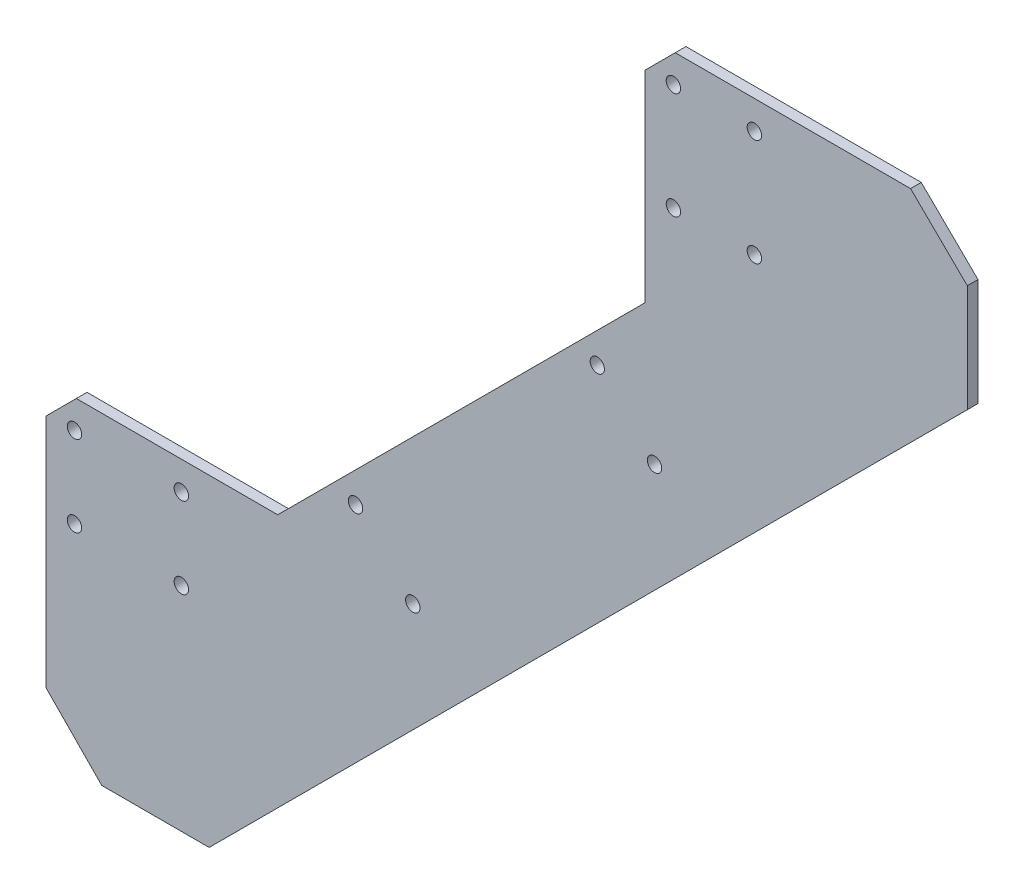
ISO-10303-21;
HEADER;
FILE_DESCRIPTION(('STEP AP214'),'2;1');
FILE_NAME('part.step','',(''),(''),'','','');
FILE_SCHEMA(('AUTOMOTIVE_DESIGN { 1 0 10303 214 1 1 1 1 }'));
ENDSEC;
DATA;
#1=APPLICATION_CONTEXT('core data for automotive mechanical design processes');
#2=APPLICATION_PROTOCOL_DEFINITION('international standard','automotive_design',2000,#1);
#3=PRODUCT_CONTEXT('',#1,'mechanical');
#4=PRODUCT('Part','Part','',(#3));
#5=PRODUCT_RELATED_PRODUCT_CATEGORY('part','',(#4));
#6=PRODUCT_DEFINITION_FORMATION('','',#4);
#7=PRODUCT_DEFINITION_CONTEXT('part definition',#1,'design');
#8=PRODUCT_DEFINITION('design','',#6,#7);
#9=PRODUCT_DEFINITION_SHAPE('','',#8);
#10=(LENGTH_UNIT() NAMED_UNIT(*) SI_UNIT(.MILLI.,.METRE.));
#11=(NAMED_UNIT(*) PLANE_ANGLE_UNIT() SI_UNIT($,.RADIAN.));
#12=(NAMED_UNIT(*) SI_UNIT($,.STERADIAN.) SOLID_ANGLE_UNIT());
#13=UNCERTAINTY_MEASURE_WITH_UNIT(LENGTH_MEASURE(1.E-05),#10,'distance_accuracy_value','');
#14=(GEOMETRIC_REPRESENTATION_CONTEXT(3) GLOBAL_UNCERTAINTY_ASSIGNED_CONTEXT((#13)) GLOBAL_UNIT_ASSIGNED_CONTEXT((#10,
#11,#12)) REPRESENTATION_CONTEXT('',''));
#15=CARTESIAN_POINT('',(0.,0.,0.));
#16=DIRECTION('',(0.,0.,1.));
#17=DIRECTION('',(1.,0.,0.));
#18=AXIS2_PLACEMENT_3D('',#15,#16,#17);
#19=CARTESIAN_POINT('',(0.,0.,0.));
#20=DIRECTION('',(0.,0.,1.));
#21=DIRECTION('',(1.,0.,0.));
#22=AXIS2_PLACEMENT_3D('',#19,#20,#21);
#23=PLANE('',#22);
#24=CARTESIAN_POINT('',(123.830158857616,-55.9479078637067,0.));
#25=DIRECTION('',(0.,0.,1.));
#26=DIRECTION('',(1.,0.,0.));
#27=AXIS2_PLACEMENT_3D('',#24,#25,#26);
#28=CIRCLE('',#27,2.00000000000003);
#29=CARTESIAN_POINT('',(125.830158857616,-55.9479078637067,0.));
#30=VERTEX_POINT('',#29);
#31=EDGE_CURVE('E19',#30,#30,#28,.T.);
#32=ORIENTED_EDGE('',*,*,#31,.T.);
#33=EDGE_LOOP('',(#32));
#34=FACE_BOUND('',#33,.T.);
#35=CARTESIAN_POINT('',(145.204781464245,22.9717027067032,0.));
#36=DIRECTION('',(0.,0.,-1.));
#37=DIRECTION('',(1.,0.,0.));
#38=AXIS2_PLACEMENT_3D('',#35,#36,#37);
#39=CIRCLE('',#38,2.025);
#40=CARTESIAN_POINT('',(147.229781464245,22.9717027067032,0.));
#41=VERTEX_POINT('',#40);
#42=EDGE_CURVE('E168',#41,#41,#39,.T.);
#43=ORIENTED_EDGE('',*,*,#42,.F.);
#44=EDGE_LOOP('',(#43));
#45=FACE_BOUND('',#44,.T.);
#46=CARTESIAN_POINT('',(72.0271799658648,-139.909430959773,0.));
#47=DIRECTION('',(0.,0.,1.));
#48=DIRECTION('',(1.,0.,0.));
#49=AXIS2_PLACEMENT_3D('',#46,#47,#48);
#50=CIRCLE('',#49,2.025);
#51=CARTESIAN_POINT('',(74.0521799658648,-139.909430959773,0.));
#52=VERTEX_POINT('',#51);
#53=EDGE_CURVE('E174',#52,#52,#50,.T.);
#54=ORIENTED_EDGE('',*,*,#53,.T.);
#55=EDGE_LOOP('',(#54));
#56=FACE_BOUND('',#55,.T.);
#57=CARTESIAN_POINT('',(167.944306144204,22.9717027067032,0.));
#58=DIRECTION('',(0.,0.,-1.));
#59=DIRECTION('',(1.,0.,0.));
#60=AXIS2_PLACEMENT_3D('',#57,#58,#59);
#61=CIRCLE('',#60,2.025);
#62=CARTESIAN_POINT('',(169.969306144204,22.9717027067032,0.));
#63=VERTEX_POINT('',#62);
#64=EDGE_CURVE('E181',#63,#63,#61,.T.);
#65=ORIENTED_EDGE('',*,*,#64,.F.);
#66=EDGE_LOOP('',(#65));
#67=FACE_BOUND('',#66,.T.);
#68=CARTESIAN_POINT('',(167.944306144204,-7.02829729329679,0.));
#69=DIRECTION('',(0.,0.,-1.));
#70=DIRECTION('',(1.,0.,0.));
#71=AXIS2_PLACEMENT_3D('',#68,#69,#70);
#72=CIRCLE('',#71,2.025);
#73=CARTESIAN_POINT('',(169.969306144204,-7.02829729329679,0.));
#74=VERTEX_POINT('',#73);
#75=EDGE_CURVE('E204',#74,#74,#72,.T.);
#76=ORIENTED_EDGE('',*,*,#75,.F.);
#77=EDGE_LOOP('',(#76));
#78=FACE_BOUND('',#77,.T.);
#79=CARTESIAN_POINT('',(55.947907863707,-123.830158857616,0.));
#80=DIRECTION('',(0.,0.,1.));
#81=DIRECTION('',(1.,0.,0.));
#82=AXIS2_PLACEMENT_3D('',#79,#80,#81);
#83=CIRCLE('',#82,2.02500000000003);
#84=CARTESIAN_POINT('',(57.972907863707,-123.830158857616,0.));
#85=VERTEX_POINT('',#84);
#86=EDGE_CURVE('E210',#85,#85,#83,.T.);
#87=ORIENTED_EDGE('',*,*,#86,.T.);
#88=EDGE_LOOP('',(#87));
#89=FACE_BOUND('',#88,.T.);
#90=CARTESIAN_POINT('',(145.204781464245,-7.02829729329682,0.));
#91=DIRECTION('',(0.,0.,-1.));
#92=DIRECTION('',(1.,0.,0.));
#93=AXIS2_PLACEMENT_3D('',#90,#91,#92);
#94=CIRCLE('',#93,2.025);
#95=CARTESIAN_POINT('',(147.229781464245,-7.02829729329682,0.));
#96=VERTEX_POINT('',#95);
#97=EDGE_CURVE('E214',#96,#96,#94,.T.);
#98=ORIENTED_EDGE('',*,*,#97,.F.);
#99=EDGE_LOOP('',(#98));
#100=FACE_BOUND('',#99,.T.);
#101=CARTESIAN_POINT('',(139.909430959774,-72.0271799658645,0.));
#102=DIRECTION('',(0.,0.,-1.));
#103=DIRECTION('',(1.,0.,0.));
#104=AXIS2_PLACEMENT_3D('',#101,#102,#103);
#105=CIRCLE('',#104,2.025);
#106=CARTESIAN_POINT('',(141.934430959774,-72.0271799658645,0.));
#107=VERTEX_POINT('',#106);
#108=EDGE_CURVE('E195',#107,#107,#105,.T.);
#109=ORIENTED_EDGE('',*,*,#108,.F.);
#110=EDGE_LOOP('',(#109));
#111=FACE_BOUND('',#110,.T.);
#112=CARTESIAN_POINT('',(-22.9717027067029,-145.204781464245,0.));
#113=DIRECTION('',(0.,0.,1.));
#114=DIRECTION('',(1.,0.,0.));
#115=AXIS2_PLACEMENT_3D('',#112,#113,#114);
#116=CIRCLE('',#115,2.025);
#117=CARTESIAN_POINT('',(-20.9467027067029,-145.204781464245,0.));
#118=VERTEX_POINT('',#117);
#119=EDGE_CURVE('E194',#118,#118,#116,.T.);
#120=ORIENTED_EDGE('',*,*,#119,.T.);
#121=EDGE_LOOP('',(#120));
#122=FACE_BOUND('',#121,.T.);
#123=CARTESIAN_POINT('',(7.0282972932971,-145.204781464245,0.));
#124=DIRECTION('',(0.,0.,1.));
#125=DIRECTION('',(1.,0.,0.));
#126=AXIS2_PLACEMENT_3D('',#123,#124,#125);
#127=CIRCLE('',#126,2.025);
#128=CARTESIAN_POINT('',(9.05329729329711,-145.204781464245,0.));
#129=VERTEX_POINT('',#128);
#130=EDGE_CURVE('E182',#129,#129,#127,.T.);
#131=ORIENTED_EDGE('',*,*,#130,.T.);
#132=EDGE_LOOP('',(#131));
#133=FACE_BOUND('',#132,.T.);
#134=CARTESIAN_POINT('',(-22.9717027067029,-167.944306144203,0.));
#135=DIRECTION('',(0.,0.,1.));
#136=DIRECTION('',(1.,0.,0.));
#137=AXIS2_PLACEMENT_3D('',#134,#135,#136);
#138=CIRCLE('',#137,2.02500000000003);
#139=CARTESIAN_POINT('',(-20.9467027067029,-167.944306144203,0.));
#140=VERTEX_POINT('',#139);
#141=EDGE_CURVE('E151',#140,#140,#138,.T.);
#142=ORIENTED_EDGE('',*,*,#141,.T.);
#143=EDGE_LOOP('',(#142));
#144=FACE_BOUND('',#143,.T.);
#145=CARTESIAN_POINT('',(7.0282972932971,-167.944306144203,0.));
#146=DIRECTION('',(0.,0.,1.));
#147=DIRECTION('',(1.,0.,0.));
#148=AXIS2_PLACEMENT_3D('',#145,#146,#147);
#149=CIRCLE('',#148,2.025);
#150=CARTESIAN_POINT('',(9.05329729329712,-167.944306144203,0.));
#151=VERTEX_POINT('',#150);
#152=EDGE_CURVE('E138',#151,#151,#149,.T.);
#153=ORIENTED_EDGE('',*,*,#152,.T.);
#154=EDGE_LOOP('',(#153));
#155=FACE_BOUND('',#154,.T.);
#156=DIRECTION('',(1.,0.,0.));
#157=VECTOR('',#156,1.);
#158=CARTESIAN_POINT('',(0.,30.9717027067032,0.));
#159=LINE('',#158,#157);
#160=CARTESIAN_POINT('',(145.718860999421,30.9717027067032,0.));
#161=VERTEX_POINT('',#160);
#162=CARTESIAN_POINT('',(211.799971873742,30.9717027067032,0.));
#163=VERTEX_POINT('',#162);
#164=EDGE_CURVE('E369',#161,#163,#159,.T.);
#165=ORIENTED_EDGE('',*,*,#164,.T.);
#166=DIRECTION('',(0.713356862623271,-0.700800960721576,0.));
#167=VECTOR('',#166,1.);
#168=CARTESIAN_POINT('',(119.503032935973,121.644109279468,0.));
#169=LINE('',#168,#167);
#170=CARTESIAN_POINT('',(227.735842241859,15.316322000275,0.));
#171=VERTEX_POINT('',#170);
#172=EDGE_CURVE('E198',#163,#171,#169,.T.);
#173=ORIENTED_EDGE('',*,*,#172,.T.);
#174=DIRECTION('',(4.68866902352455E-06,-0.999999999989008,0.));
#175=VECTOR('',#174,1.);
#176=CARTESIAN_POINT('',(227.735914050017,0.0010677783257621,0.));
#177=LINE('',#176,#175);
#178=CARTESIAN_POINT('',(227.735983663215,-14.8460451100178,0.));
#179=VERTEX_POINT('',#178);
#180=EDGE_CURVE('E158',#171,#179,#177,.T.);
#181=ORIENTED_EDGE('',*,*,#180,.T.);
#182=DIRECTION('',(0.707106781186548,0.707106781186548,0.));
#183=VECTOR('',#182,1.);
#184=CARTESIAN_POINT('',(121.291014386616,-121.291014386616,0.));
#185=LINE('',#184,#183);
#186=CARTESIAN_POINT('',(14.846045110018,-227.735983663215,0.));
#187=VERTEX_POINT('',#186);
#188=EDGE_CURVE('E309',#187,#179,#185,.T.);
#189=ORIENTED_EDGE('',*,*,#188,.F.);
#190=DIRECTION('',(0.999999999989008,-4.68866902260434E-06,0.));
#191=VECTOR('',#190,1.);
#192=CARTESIAN_POINT('',(-0.00106777832555254,-227.735914050017,0.));
#193=LINE('',#192,#191);
#194=CARTESIAN_POINT('',(-15.3163220002748,-227.735842241859,0.));
#195=VERTEX_POINT('',#194);
#196=EDGE_CURVE('E465',#195,#187,#193,.T.);
#197=ORIENTED_EDGE('',*,*,#196,.F.);
#198=DIRECTION('',(0.700800960721575,-0.713356862623272,0.));
#199=VECTOR('',#198,1.);
#200=CARTESIAN_POINT('',(-121.644109279468,-119.503032935973,0.));
#201=LINE('',#200,#199);
#202=CARTESIAN_POINT('',(-30.9717027067029,-211.799971873742,0.));
#203=VERTEX_POINT('',#202);
#204=EDGE_CURVE('E390',#203,#195,#201,.T.);
#205=ORIENTED_EDGE('',*,*,#204,.F.);
#206=DIRECTION('',(0.,-1.,0.));
#207=VECTOR('',#206,1.);
#208=CARTESIAN_POINT('',(-30.9717027067029,0.,0.));
#209=LINE('',#208,#207);
#210=CARTESIAN_POINT('',(-30.9717027067029,-145.718860999421,0.));
#211=VERTEX_POINT('',#210);
#212=EDGE_CURVE('E447',#211,#203,#209,.T.);
#213=ORIENTED_EDGE('',*,*,#212,.F.);
#214=DIRECTION('',(0.707106781186548,0.707106781186548,0.));
#215=VECTOR('',#214,1.);
#216=CARTESIAN_POINT('',(57.3735791463591,-57.3735791463592,0.));
#217=LINE('',#216,#215);
#218=CARTESIAN_POINT('',(-22.4576231715266,-137.204781464245,0.));
#219=VERTEX_POINT('',#218);
#220=EDGE_CURVE('E435',#211,#219,#217,.T.);
#221=ORIENTED_EDGE('',*,*,#220,.T.);
#222=DIRECTION('',(1.,0.,0.));
#223=VECTOR('',#222,1.);
#224=CARTESIAN_POINT('',(0.,-137.204781464245,0.));
#225=LINE('',#224,#223);
#226=CARTESIAN_POINT('',(34.1008837653839,-137.204781464245,0.));
#227=VERTEX_POINT('',#226);
#228=EDGE_CURVE('E396',#219,#227,#225,.T.);
#229=ORIENTED_EDGE('',*,*,#228,.T.);
#230=DIRECTION('',(0.707106781186548,0.707106781186548,0.));
#231=VECTOR('',#230,1.);
#232=CARTESIAN_POINT('',(85.6528326148144,-85.6528326148144,0.));
#233=LINE('',#232,#231);
#234=CARTESIAN_POINT('',(137.204781464245,-34.1008837653837,0.));
#235=VERTEX_POINT('',#234);
#236=EDGE_CURVE('E420',#227,#235,#233,.T.);
#237=ORIENTED_EDGE('',*,*,#236,.T.);
#238=DIRECTION('',(0.,-1.,0.));
#239=VECTOR('',#238,1.);
#240=CARTESIAN_POINT('',(137.204781464245,1.34664010526467E-13,0.));
#241=LINE('',#240,#239);
#242=CARTESIAN_POINT('',(137.204781464245,22.4576231715269,0.));
#243=VERTEX_POINT('',#242);
#244=EDGE_CURVE('E405',#243,#235,#241,.T.);
#245=ORIENTED_EDGE('',*,*,#244,.F.);
#246=DIRECTION('',(-0.707106781186548,-0.707106781186548,0.));
#247=VECTOR('',#246,1.);
#248=CARTESIAN_POINT('',(57.3735791463591,-57.3735791463591,0.));
#249=LINE('',#248,#247);
#250=EDGE_CURVE('E384',#161,#243,#249,.T.);
#251=ORIENTED_EDGE('',*,*,#250,.F.);
#252=EDGE_LOOP('',(#165,#173,#181,#189,#197,#205,#213,#221,#229,#237,#245,#251));
#253=FACE_BOUND('',#252,.T.);
#254=ADVANCED_FACE('F16',(#34,#45,#56,#67,#78,#89,#100,#111,#122,#133,#144,#155,#253),#23,.F.);
#255=CARTESIAN_POINT('',(0.,0.,3.));
#256=DIRECTION('',(0.,0.,1.));
#257=DIRECTION('',(1.,0.,0.));
#258=AXIS2_PLACEMENT_3D('',#255,#256,#257);
#259=PLANE('',#258);
#260=CARTESIAN_POINT('',(123.830158857616,-55.9479078637067,3.));
#261=DIRECTION('',(0.,0.,1.));
#262=DIRECTION('',(1.,0.,0.));
#263=AXIS2_PLACEMENT_3D('',#260,#261,#262);
#264=CIRCLE('',#263,2.00000000000003);
#265=CARTESIAN_POINT('',(125.830158857616,-55.9479078637067,3.));
#266=VERTEX_POINT('',#265);
#267=EDGE_CURVE('E10',#266,#266,#264,.T.);
#268=ORIENTED_EDGE('',*,*,#267,.F.);
#269=EDGE_LOOP('',(#268));
#270=FACE_BOUND('',#269,.T.);
#271=CARTESIAN_POINT('',(145.204781464245,22.9717027067032,3.));
#272=DIRECTION('',(0.,0.,-1.));
#273=DIRECTION('',(1.,0.,0.));
#274=AXIS2_PLACEMENT_3D('',#271,#272,#273);
#275=CIRCLE('',#274,2.025);
#276=CARTESIAN_POINT('',(147.229781464245,22.9717027067032,3.));
#277=VERTEX_POINT('',#276);
#278=EDGE_CURVE('E171',#277,#277,#275,.T.);
#279=ORIENTED_EDGE('',*,*,#278,.T.);
#280=EDGE_LOOP('',(#279));
#281=FACE_BOUND('',#280,.T.);
#282=CARTESIAN_POINT('',(72.0271799658648,-139.909430959773,3.));
#283=DIRECTION('',(0.,0.,1.));
#284=DIRECTION('',(1.,0.,0.));
#285=AXIS2_PLACEMENT_3D('',#282,#283,#284);
#286=CIRCLE('',#285,2.025);
#287=CARTESIAN_POINT('',(74.0521799658648,-139.909430959773,3.));
#288=VERTEX_POINT('',#287);
#289=EDGE_CURVE('E177',#288,#288,#286,.T.);
#290=ORIENTED_EDGE('',*,*,#289,.F.);
#291=EDGE_LOOP('',(#290));
#292=FACE_BOUND('',#291,.T.);
#293=CARTESIAN_POINT('',(167.944306144204,22.9717027067032,3.));
#294=DIRECTION('',(0.,0.,-1.));
#295=DIRECTION('',(1.,0.,0.));
#296=AXIS2_PLACEMENT_3D('',#293,#294,#295);
#297=CIRCLE('',#296,2.025);
#298=CARTESIAN_POINT('',(169.969306144204,22.9717027067032,3.));
#299=VERTEX_POINT('',#298);
#300=EDGE_CURVE('E190',#299,#299,#297,.T.);
#301=ORIENTED_EDGE('',*,*,#300,.T.);
#302=EDGE_LOOP('',(#301));
#303=FACE_BOUND('',#302,.T.);
#304=CARTESIAN_POINT('',(167.944306144204,-7.02829729329679,3.));
#305=DIRECTION('',(0.,0.,-1.));
#306=DIRECTION('',(1.,0.,0.));
#307=AXIS2_PLACEMENT_3D('',#304,#305,#306);
#308=CIRCLE('',#307,2.025);
#309=CARTESIAN_POINT('',(169.969306144204,-7.02829729329679,3.));
#310=VERTEX_POINT('',#309);
#311=EDGE_CURVE('E207',#310,#310,#308,.T.);
#312=ORIENTED_EDGE('',*,*,#311,.T.);
#313=EDGE_LOOP('',(#312));
#314=FACE_BOUND('',#313,.T.);
#315=CARTESIAN_POINT('',(55.947907863707,-123.830158857616,3.));
#316=DIRECTION('',(0.,0.,1.));
#317=DIRECTION('',(1.,0.,0.));
#318=AXIS2_PLACEMENT_3D('',#315,#316,#317);
#319=CIRCLE('',#318,2.02500000000003);
#320=CARTESIAN_POINT('',(57.972907863707,-123.830158857616,3.));
#321=VERTEX_POINT('',#320);
#322=EDGE_CURVE('E213',#321,#321,#319,.T.);
#323=ORIENTED_EDGE('',*,*,#322,.F.);
#324=EDGE_LOOP('',(#323));
#325=FACE_BOUND('',#324,.T.);
#326=CARTESIAN_POINT('',(145.204781464245,-7.02829729329682,3.));
#327=DIRECTION('',(0.,0.,-1.));
#328=DIRECTION('',(1.,0.,0.));
#329=AXIS2_PLACEMENT_3D('',#326,#327,#328);
#330=CIRCLE('',#329,2.025);
#331=CARTESIAN_POINT('',(147.229781464245,-7.02829729329682,3.));
#332=VERTEX_POINT('',#331);
#333=EDGE_CURVE('E217',#332,#332,#330,.T.);
#334=ORIENTED_EDGE('',*,*,#333,.T.);
#335=EDGE_LOOP('',(#334));
#336=FACE_BOUND('',#335,.T.);
#337=CARTESIAN_POINT('',(139.909430959774,-72.0271799658645,3.));
#338=DIRECTION('',(0.,0.,-1.));
#339=DIRECTION('',(1.,0.,0.));
#340=AXIS2_PLACEMENT_3D('',#337,#338,#339);
#341=CIRCLE('',#340,2.025);
#342=CARTESIAN_POINT('',(141.934430959774,-72.0271799658645,3.));
#343=VERTEX_POINT('',#342);
#344=EDGE_CURVE('E191',#343,#343,#341,.T.);
#345=ORIENTED_EDGE('',*,*,#344,.T.);
#346=EDGE_LOOP('',(#345));
#347=FACE_BOUND('',#346,.T.);
#348=CARTESIAN_POINT('',(-22.9717027067029,-145.204781464245,3.));
#349=DIRECTION('',(0.,0.,1.));
#350=DIRECTION('',(1.,0.,0.));
#351=AXIS2_PLACEMENT_3D('',#348,#349,#350);
#352=CIRCLE('',#351,2.025);
#353=CARTESIAN_POINT('',(-20.9467027067029,-145.204781464245,3.));
#354=VERTEX_POINT('',#353);
#355=EDGE_CURVE('E187',#354,#354,#352,.T.);
#356=ORIENTED_EDGE('',*,*,#355,.F.);
#357=EDGE_LOOP('',(#356));
#358=FACE_BOUND('',#357,.T.);
#359=CARTESIAN_POINT('',(7.0282972932971,-145.204781464245,3.));
#360=DIRECTION('',(0.,0.,1.));
#361=DIRECTION('',(1.,0.,0.));
#362=AXIS2_PLACEMENT_3D('',#359,#360,#361);
#363=CIRCLE('',#362,2.025);
#364=CARTESIAN_POINT('',(9.05329729329711,-145.204781464245,3.));
#365=VERTEX_POINT('',#364);
#366=EDGE_CURVE('E186',#365,#365,#363,.T.);
#367=ORIENTED_EDGE('',*,*,#366,.F.);
#368=EDGE_LOOP('',(#367));
#369=FACE_BOUND('',#368,.T.);
#370=CARTESIAN_POINT('',(-22.9717027067029,-167.944306144203,3.));
#371=DIRECTION('',(0.,0.,1.));
#372=DIRECTION('',(1.,0.,0.));
#373=AXIS2_PLACEMENT_3D('',#370,#371,#372);
#374=CIRCLE('',#373,2.02500000000003);
#375=CARTESIAN_POINT('',(-20.9467027067029,-167.944306144203,3.));
#376=VERTEX_POINT('',#375);
#377=EDGE_CURVE('E143',#376,#376,#374,.T.);
#378=ORIENTED_EDGE('',*,*,#377,.F.);
#379=EDGE_LOOP('',(#378));
#380=FACE_BOUND('',#379,.T.);
#381=CARTESIAN_POINT('',(7.0282972932971,-167.944306144203,3.));
#382=DIRECTION('',(0.,0.,1.));
#383=DIRECTION('',(1.,0.,0.));
#384=AXIS2_PLACEMENT_3D('',#381,#382,#383);
#385=CIRCLE('',#384,2.025);
#386=CARTESIAN_POINT('',(9.05329729329712,-167.944306144203,3.));
#387=VERTEX_POINT('',#386);
#388=EDGE_CURVE('E142',#387,#387,#385,.T.);
#389=ORIENTED_EDGE('',*,*,#388,.F.);
#390=EDGE_LOOP('',(#389));
#391=FACE_BOUND('',#390,.T.);
#392=DIRECTION('',(1.,0.,0.));
#393=VECTOR('',#392,1.);
#394=CARTESIAN_POINT('',(0.,30.9717027067032,3.));
#395=LINE('',#394,#393);
#396=CARTESIAN_POINT('',(145.718860999421,30.9717027067032,3.));
#397=VERTEX_POINT('',#396);
#398=CARTESIAN_POINT('',(211.799971873742,30.9717027067032,3.));
#399=VERTEX_POINT('',#398);
#400=EDGE_CURVE('E345',#397,#399,#395,.T.);
#401=ORIENTED_EDGE('',*,*,#400,.F.);
#402=DIRECTION('',(-0.707106781186548,-0.707106781186548,0.));
#403=VECTOR('',#402,1.);
#404=CARTESIAN_POINT('',(57.3735791463591,-57.3735791463591,3.));
#405=LINE('',#404,#403);
#406=CARTESIAN_POINT('',(137.204781464245,22.4576231715269,3.));
#407=VERTEX_POINT('',#406);
#408=EDGE_CURVE('E350',#397,#407,#405,.T.);
#409=ORIENTED_EDGE('',*,*,#408,.T.);
#410=DIRECTION('',(0.,-1.,0.));
#411=VECTOR('',#410,1.);
#412=CARTESIAN_POINT('',(137.204781464245,1.34664010526467E-13,3.));
#413=LINE('',#412,#411);
#414=CARTESIAN_POINT('',(137.204781464245,-34.1008837653837,3.));
#415=VERTEX_POINT('',#414);
#416=EDGE_CURVE('E417',#407,#415,#413,.T.);
#417=ORIENTED_EDGE('',*,*,#416,.T.);
#418=DIRECTION('',(0.707106781186548,0.707106781186548,0.));
#419=VECTOR('',#418,1.);
#420=CARTESIAN_POINT('',(85.6528326148144,-85.6528326148144,3.));
#421=LINE('',#420,#419);
#422=CARTESIAN_POINT('',(34.1008837653839,-137.204781464245,3.));
#423=VERTEX_POINT('',#422);
#424=EDGE_CURVE('E412',#423,#415,#421,.T.);
#425=ORIENTED_EDGE('',*,*,#424,.F.);
#426=DIRECTION('',(1.,0.,0.));
#427=VECTOR('',#426,1.);
#428=CARTESIAN_POINT('',(0.,-137.204781464245,3.));
#429=LINE('',#428,#427);
#430=CARTESIAN_POINT('',(-22.4576231715266,-137.204781464245,3.));
#431=VERTEX_POINT('',#430);
#432=EDGE_CURVE('E395',#431,#423,#429,.T.);
#433=ORIENTED_EDGE('',*,*,#432,.F.);
#434=DIRECTION('',(0.707106781186548,0.707106781186548,0.));
#435=VECTOR('',#434,1.);
#436=CARTESIAN_POINT('',(57.3735791463591,-57.3735791463592,3.));
#437=LINE('',#436,#435);
#438=CARTESIAN_POINT('',(-30.9717027067029,-145.718860999421,3.));
#439=VERTEX_POINT('',#438);
#440=EDGE_CURVE('E443',#439,#431,#437,.T.);
#441=ORIENTED_EDGE('',*,*,#440,.F.);
#442=DIRECTION('',(0.,-1.,0.));
#443=VECTOR('',#442,1.);
#444=CARTESIAN_POINT('',(-30.9717027067029,0.,3.));
#445=LINE('',#444,#443);
#446=CARTESIAN_POINT('',(-30.9717027067029,-211.799971873742,3.));
#447=VERTEX_POINT('',#446);
#448=EDGE_CURVE('E455',#439,#447,#445,.T.);
#449=ORIENTED_EDGE('',*,*,#448,.T.);
#450=DIRECTION('',(0.700800960721575,-0.713356862623272,0.));
#451=VECTOR('',#450,1.);
#452=CARTESIAN_POINT('',(-121.644109279468,-119.503032935973,3.));
#453=LINE('',#452,#451);
#454=CARTESIAN_POINT('',(-15.3163220002748,-227.735842241859,3.));
#455=VERTEX_POINT('',#454);
#456=EDGE_CURVE('E389',#447,#455,#453,.T.);
#457=ORIENTED_EDGE('',*,*,#456,.T.);
#458=DIRECTION('',(0.999999999989008,-4.68866902260434E-06,0.));
#459=VECTOR('',#458,1.);
#460=CARTESIAN_POINT('',(-0.00106777832555254,-227.735914050017,3.));
#461=LINE('',#460,#459);
#462=CARTESIAN_POINT('',(14.846045110018,-227.735983663215,3.));
#463=VERTEX_POINT('',#462);
#464=EDGE_CURVE('E472',#455,#463,#461,.T.);
#465=ORIENTED_EDGE('',*,*,#464,.T.);
#466=DIRECTION('',(0.707106781186548,0.707106781186548,0.));
#467=VECTOR('',#466,1.);
#468=CARTESIAN_POINT('',(121.291014386616,-121.291014386616,3.));
#469=LINE('',#468,#467);
#470=CARTESIAN_POINT('',(227.735983663215,-14.8460451100178,3.));
#471=VERTEX_POINT('',#470);
#472=EDGE_CURVE('E154',#463,#471,#469,.T.);
#473=ORIENTED_EDGE('',*,*,#472,.T.);
#474=DIRECTION('',(4.68866902352455E-06,-0.999999999989008,0.));
#475=VECTOR('',#474,1.);
#476=CARTESIAN_POINT('',(227.735914050017,0.0010677783257621,3.));
#477=LINE('',#476,#475);
#478=CARTESIAN_POINT('',(227.735842241859,15.316322000275,3.));
#479=VERTEX_POINT('',#478);
#480=EDGE_CURVE('E167',#479,#471,#477,.T.);
#481=ORIENTED_EDGE('',*,*,#480,.F.);
#482=DIRECTION('',(0.713356862623271,-0.700800960721576,0.));
#483=VECTOR('',#482,1.);
#484=CARTESIAN_POINT('',(119.503032935973,121.644109279468,3.));
#485=LINE('',#484,#483);
#486=EDGE_CURVE('E201',#399,#479,#485,.T.);
#487=ORIENTED_EDGE('',*,*,#486,.F.);
#488=EDGE_LOOP('',(#401,#409,#417,#425,#433,#441,#449,#457,#465,#473,#481,#487));
#489=FACE_BOUND('',#488,.T.);
#490=ADVANCED_FACE('F251',(#270,#281,#292,#303,#314,#325,#336,#347,#358,#369,#380,#391,#489),
#259,.T.);
#491=CARTESIAN_POINT('',(123.830158857616,-55.9479078637067,3.));
#492=DIRECTION('',(0.,0.,-1.));
#493=DIRECTION('',(-1.,0.,0.));
#494=AXIS2_PLACEMENT_3D('',#491,#492,#493);
#495=CYLINDRICAL_SURFACE('',#494,2.00000000000003);
#496=ORIENTED_EDGE('',*,*,#267,.T.);
#497=EDGE_LOOP('',(#496));
#498=FACE_BOUND('',#497,.T.);
#499=ORIENTED_EDGE('',*,*,#31,.F.);
#500=EDGE_LOOP('',(#499));
#501=FACE_BOUND('',#500,.T.);
#502=ADVANCED_FACE('F247',(#498,#501),#495,.F.);
#503=CARTESIAN_POINT('',(7.0282972932971,-167.944306144203,3.));
#504=DIRECTION('',(0.,0.,-1.));
#505=DIRECTION('',(-1.,0.,0.));
#506=AXIS2_PLACEMENT_3D('',#503,#504,#505);
#507=CYLINDRICAL_SURFACE('',#506,2.025);
#508=ORIENTED_EDGE('',*,*,#388,.T.);
#509=EDGE_LOOP('',(#508));
#510=FACE_BOUND('',#509,.T.);
#511=ORIENTED_EDGE('',*,*,#152,.F.);
#512=EDGE_LOOP('',(#511));
#513=FACE_BOUND('',#512,.T.);
#514=ADVANCED_FACE('F235',(#510,#513),#507,.F.);
#515=CARTESIAN_POINT('',(-22.9717027067029,-167.944306144203,3.));
#516=DIRECTION('',(0.,0.,-1.));
#517=DIRECTION('',(-1.,0.,0.));
#518=AXIS2_PLACEMENT_3D('',#515,#516,#517);
#519=CYLINDRICAL_SURFACE('',#518,2.02500000000003);
#520=ORIENTED_EDGE('',*,*,#377,.T.);
#521=EDGE_LOOP('',(#520));
#522=FACE_BOUND('',#521,.T.);
#523=ORIENTED_EDGE('',*,*,#141,.F.);
#524=EDGE_LOOP('',(#523));
#525=FACE_BOUND('',#524,.T.);
#526=ADVANCED_FACE('F232',(#522,#525),#519,.F.);
#527=CARTESIAN_POINT('',(7.0282972932971,-145.204781464245,3.));
#528=DIRECTION('',(0.,0.,-1.));
#529=DIRECTION('',(-1.,0.,0.));
#530=AXIS2_PLACEMENT_3D('',#527,#528,#529);
#531=CYLINDRICAL_SURFACE('',#530,2.025);
#532=ORIENTED_EDGE('',*,*,#366,.T.);
#533=EDGE_LOOP('',(#532));
#534=FACE_BOUND('',#533,.T.);
#535=ORIENTED_EDGE('',*,*,#130,.F.);
#536=EDGE_LOOP('',(#535));
#537=FACE_BOUND('',#536,.T.);
#538=ADVANCED_FACE('F234',(#534,#537),#531,.F.);
#539=CARTESIAN_POINT('',(-22.9717027067029,-145.204781464245,3.));
#540=DIRECTION('',(0.,0.,-1.));
#541=DIRECTION('',(-1.,0.,0.));
#542=AXIS2_PLACEMENT_3D('',#539,#540,#541);
#543=CYLINDRICAL_SURFACE('',#542,2.025);
#544=ORIENTED_EDGE('',*,*,#355,.T.);
#545=EDGE_LOOP('',(#544));
#546=FACE_BOUND('',#545,.T.);
#547=ORIENTED_EDGE('',*,*,#119,.F.);
#548=EDGE_LOOP('',(#547));
#549=FACE_BOUND('',#548,.T.);
#550=ADVANCED_FACE('F244',(#546,#549),#543,.F.);
#551=CARTESIAN_POINT('',(139.909430959774,-72.0271799658645,3.));
#552=DIRECTION('',(0.,0.,-1.));
#553=DIRECTION('',(-1.,0.,0.));
#554=AXIS2_PLACEMENT_3D('',#551,#552,#553);
#555=CYLINDRICAL_SURFACE('',#554,2.025);
#556=ORIENTED_EDGE('',*,*,#344,.F.);
#557=EDGE_LOOP('',(#556));
#558=FACE_BOUND('',#557,.T.);
#559=ORIENTED_EDGE('',*,*,#108,.T.);
#560=EDGE_LOOP('',(#559));
#561=FACE_BOUND('',#560,.T.);
#562=ADVANCED_FACE('F940',(#558,#561),#555,.F.);
#563=CARTESIAN_POINT('',(145.204781464245,-7.02829729329682,3.));
#564=DIRECTION('',(0.,0.,-1.));
#565=DIRECTION('',(-1.,0.,0.));
#566=AXIS2_PLACEMENT_3D('',#563,#564,#565);
#567=CYLINDRICAL_SURFACE('',#566,2.025);
#568=ORIENTED_EDGE('',*,*,#333,.F.);
#569=EDGE_LOOP('',(#568));
#570=FACE_BOUND('',#569,.T.);
#571=ORIENTED_EDGE('',*,*,#97,.T.);
#572=EDGE_LOOP('',(#571));
#573=FACE_BOUND('',#572,.T.);
#574=ADVANCED_FACE('F944',(#570,#573),#567,.F.);
#575=CARTESIAN_POINT('',(55.947907863707,-123.830158857616,3.));
#576=DIRECTION('',(0.,0.,-1.));
#577=DIRECTION('',(-1.,0.,0.));
#578=AXIS2_PLACEMENT_3D('',#575,#576,#577);
#579=CYLINDRICAL_SURFACE('',#578,2.02500000000003);
#580=ORIENTED_EDGE('',*,*,#322,.T.);
#581=EDGE_LOOP('',(#580));
#582=FACE_BOUND('',#581,.T.);
#583=ORIENTED_EDGE('',*,*,#86,.F.);
#584=EDGE_LOOP('',(#583));
#585=FACE_BOUND('',#584,.T.);
#586=ADVANCED_FACE('F977',(#582,#585),#579,.F.);
#587=CARTESIAN_POINT('',(167.944306144204,-7.02829729329679,3.));
#588=DIRECTION('',(0.,0.,-1.));
#589=DIRECTION('',(-1.,0.,0.));
#590=AXIS2_PLACEMENT_3D('',#587,#588,#589);
#591=CYLINDRICAL_SURFACE('',#590,2.025);
#592=ORIENTED_EDGE('',*,*,#311,.F.);
#593=EDGE_LOOP('',(#592));
#594=FACE_BOUND('',#593,.T.);
#595=ORIENTED_EDGE('',*,*,#75,.T.);
#596=EDGE_LOOP('',(#595));
#597=FACE_BOUND('',#596,.T.);
#598=ADVANCED_FACE('F956',(#594,#597),#591,.F.);
#599=CARTESIAN_POINT('',(119.503032935973,121.644109279468,3.));
#600=DIRECTION('',(0.700800960721576,0.713356862623271,0.));
#601=DIRECTION('',(0.,0.,-1.));
#602=AXIS2_PLACEMENT_3D('',#599,#600,#601);
#603=PLANE('',#602);
#604=ORIENTED_EDGE('',*,*,#172,.F.);
#605=DIRECTION('',(0.,0.,-1.));
#606=VECTOR('',#605,1.);
#607=CARTESIAN_POINT('',(211.799971873742,30.9717027067032,3.));
#608=LINE('',#607,#606);
#609=EDGE_CURVE('E361',#399,#163,#608,.T.);
#610=ORIENTED_EDGE('',*,*,#609,.F.);
#611=ORIENTED_EDGE('',*,*,#486,.T.);
#612=DIRECTION('',(0.,0.,-1.));
#613=VECTOR('',#612,1.);
#614=CARTESIAN_POINT('',(227.735842241859,15.316322000275,3.));
#615=LINE('',#614,#613);
#616=EDGE_CURVE('E163',#479,#171,#615,.T.);
#617=ORIENTED_EDGE('',*,*,#616,.T.);
#618=EDGE_LOOP('',(#604,#610,#611,#617));
#619=FACE_BOUND('',#618,.T.);
#620=ADVANCED_FACE('F952',(#619),#603,.T.);
#621=CARTESIAN_POINT('',(167.944306144204,22.9717027067032,3.));
#622=DIRECTION('',(0.,0.,-1.));
#623=DIRECTION('',(-1.,0.,0.));
#624=AXIS2_PLACEMENT_3D('',#621,#622,#623);
#625=CYLINDRICAL_SURFACE('',#624,2.025);
#626=ORIENTED_EDGE('',*,*,#300,.F.);
#627=EDGE_LOOP('',(#626));
#628=FACE_BOUND('',#627,.T.);
#629=ORIENTED_EDGE('',*,*,#64,.T.);
#630=EDGE_LOOP('',(#629));
#631=FACE_BOUND('',#630,.T.);
#632=ADVANCED_FACE('F813',(#628,#631),#625,.F.);
#633=CARTESIAN_POINT('',(72.0271799658648,-139.909430959773,3.));
#634=DIRECTION('',(0.,0.,-1.));
#635=DIRECTION('',(-1.,0.,0.));
#636=AXIS2_PLACEMENT_3D('',#633,#634,#635);
#637=CYLINDRICAL_SURFACE('',#636,2.025);
#638=ORIENTED_EDGE('',*,*,#289,.T.);
#639=EDGE_LOOP('',(#638));
#640=FACE_BOUND('',#639,.T.);
#641=ORIENTED_EDGE('',*,*,#53,.F.);
#642=EDGE_LOOP('',(#641));
#643=FACE_BOUND('',#642,.T.);
#644=ADVANCED_FACE('F318',(#640,#643),#637,.F.);
#645=CARTESIAN_POINT('',(145.204781464245,22.9717027067032,3.));
#646=DIRECTION('',(0.,0.,-1.));
#647=DIRECTION('',(-1.,0.,0.));
#648=AXIS2_PLACEMENT_3D('',#645,#646,#647);
#649=CYLINDRICAL_SURFACE('',#648,2.025);
#650=ORIENTED_EDGE('',*,*,#278,.F.);
#651=EDGE_LOOP('',(#650));
#652=FACE_BOUND('',#651,.T.);
#653=ORIENTED_EDGE('',*,*,#42,.T.);
#654=EDGE_LOOP('',(#653));
#655=FACE_BOUND('',#654,.T.);
#656=ADVANCED_FACE('F812',(#652,#655),#649,.F.);
#657=CARTESIAN_POINT('',(227.735914050017,0.0010677783257621,3.));
#658=DIRECTION('',(0.999999999989008,4.68866902352455E-06,0.));
#659=DIRECTION('',(0.,0.,-1.));
#660=AXIS2_PLACEMENT_3D('',#657,#658,#659);
#661=PLANE('',#660);
#662=ORIENTED_EDGE('',*,*,#180,.F.);
#663=ORIENTED_EDGE('',*,*,#616,.F.);
#664=ORIENTED_EDGE('',*,*,#480,.T.);
#665=DIRECTION('',(0.,0.,-1.));
#666=VECTOR('',#665,1.);
#667=CARTESIAN_POINT('',(227.735983663215,-14.8460451100178,3.));
#668=LINE('',#667,#666);
#669=EDGE_CURVE('E159',#471,#179,#668,.T.);
#670=ORIENTED_EDGE('',*,*,#669,.T.);
#671=EDGE_LOOP('',(#662,#663,#664,#670));
#672=FACE_BOUND('',#671,.T.);
#673=ADVANCED_FACE('F480',(#672),#661,.T.);
#674=CARTESIAN_POINT('',(121.291014386616,-121.291014386616,3.));
#675=DIRECTION('',(-0.707106781186548,0.707106781186548,0.));
#676=DIRECTION('',(0.,0.,1.));
#677=AXIS2_PLACEMENT_3D('',#674,#675,#676);
#678=PLANE('',#677);
#679=ORIENTED_EDGE('',*,*,#188,.T.);
#680=ORIENTED_EDGE('',*,*,#669,.F.);
#681=ORIENTED_EDGE('',*,*,#472,.F.);
#682=DIRECTION('',(0.,0.,-1.));
#683=VECTOR('',#682,1.);
#684=CARTESIAN_POINT('',(14.846045110018,-227.735983663215,3.));
#685=LINE('',#684,#683);
#686=EDGE_CURVE('E469',#463,#187,#685,.T.);
#687=ORIENTED_EDGE('',*,*,#686,.T.);
#688=EDGE_LOOP('',(#679,#680,#681,#687));
#689=FACE_BOUND('',#688,.T.);
#690=ADVANCED_FACE('F482',(#689),#678,.F.);
#691=CARTESIAN_POINT('',(-0.00106777832555254,-227.735914050017,3.));
#692=DIRECTION('',(4.68866902260434E-06,0.999999999989008,0.));
#693=DIRECTION('',(0.,0.,-1.));
#694=AXIS2_PLACEMENT_3D('',#691,#692,#693);
#695=PLANE('',#694);
#696=ORIENTED_EDGE('',*,*,#196,.T.);
#697=ORIENTED_EDGE('',*,*,#686,.F.);
#698=ORIENTED_EDGE('',*,*,#464,.F.);
#699=DIRECTION('',(0.,0.,-1.));
#700=VECTOR('',#699,1.);
#701=CARTESIAN_POINT('',(-15.3163220002748,-227.735842241859,3.));
#702=LINE('',#701,#700);
#703=EDGE_CURVE('E385',#455,#195,#702,.T.);
#704=ORIENTED_EDGE('',*,*,#703,.T.);
#705=EDGE_LOOP('',(#696,#697,#698,#704));
#706=FACE_BOUND('',#705,.T.);
#707=ADVANCED_FACE('F485',(#706),#695,.F.);
#708=CARTESIAN_POINT('',(-121.644109279468,-119.503032935973,3.));
#709=DIRECTION('',(0.713356862623273,0.700800960721575,0.));
#710=DIRECTION('',(0.,0.,-1.));
#711=AXIS2_PLACEMENT_3D('',#708,#709,#710);
#712=PLANE('',#711);
#713=ORIENTED_EDGE('',*,*,#204,.T.);
#714=ORIENTED_EDGE('',*,*,#703,.F.);
#715=ORIENTED_EDGE('',*,*,#456,.F.);
#716=DIRECTION('',(0.,0.,-1.));
#717=VECTOR('',#716,1.);
#718=CARTESIAN_POINT('',(-30.9717027067029,-211.799971873742,3.));
#719=LINE('',#718,#717);
#720=EDGE_CURVE('E451',#447,#203,#719,.T.);
#721=ORIENTED_EDGE('',*,*,#720,.T.);
#722=EDGE_LOOP('',(#713,#714,#715,#721));
#723=FACE_BOUND('',#722,.T.);
#724=ADVANCED_FACE('F860',(#723),#712,.F.);
#725=CARTESIAN_POINT('',(-30.9717027067029,0.,3.));
#726=DIRECTION('',(1.,0.,0.));
#727=DIRECTION('',(0.,1.,0.));
#728=AXIS2_PLACEMENT_3D('',#725,#726,#727);
#729=PLANE('',#728);
#730=ORIENTED_EDGE('',*,*,#212,.T.);
#731=ORIENTED_EDGE('',*,*,#720,.F.);
#732=ORIENTED_EDGE('',*,*,#448,.F.);
#733=DIRECTION('',(0.,0.,-1.));
#734=VECTOR('',#733,1.);
#735=CARTESIAN_POINT('',(-30.9717027067029,-145.718860999421,3.));
#736=LINE('',#735,#734);
#737=EDGE_CURVE('E439',#439,#211,#736,.T.);
#738=ORIENTED_EDGE('',*,*,#737,.T.);
#739=EDGE_LOOP('',(#730,#731,#732,#738));
#740=FACE_BOUND('',#739,.T.);
#741=ADVANCED_FACE('F864',(#740),#729,.F.);
#742=CARTESIAN_POINT('',(57.3735791463591,-57.3735791463592,3.));
#743=DIRECTION('',(-0.707106781186548,0.707106781186548,0.));
#744=DIRECTION('',(0.,0.,1.));
#745=AXIS2_PLACEMENT_3D('',#742,#743,#744);
#746=PLANE('',#745);
#747=ORIENTED_EDGE('',*,*,#220,.F.);
#748=ORIENTED_EDGE('',*,*,#737,.F.);
#749=ORIENTED_EDGE('',*,*,#440,.T.);
#750=DIRECTION('',(0.,0.,-1.));
#751=VECTOR('',#750,1.);
#752=CARTESIAN_POINT('',(-22.4576231715266,-137.204781464245,3.));
#753=LINE('',#752,#751);
#754=EDGE_CURVE('E391',#431,#219,#753,.T.);
#755=ORIENTED_EDGE('',*,*,#754,.T.);
#756=EDGE_LOOP('',(#747,#748,#749,#755));
#757=FACE_BOUND('',#756,.T.);
#758=ADVANCED_FACE('F875',(#757),#746,.T.);
#759=CARTESIAN_POINT('',(0.,-137.204781464245,3.));
#760=DIRECTION('',(0.,1.,0.));
#761=DIRECTION('',(1.,0.,0.));
#762=AXIS2_PLACEMENT_3D('',#759,#760,#761);
#763=PLANE('',#762);
#764=ORIENTED_EDGE('',*,*,#228,.F.);
#765=ORIENTED_EDGE('',*,*,#754,.F.);
#766=ORIENTED_EDGE('',*,*,#432,.T.);
#767=DIRECTION('',(0.,0.,-1.));
#768=VECTOR('',#767,1.);
#769=CARTESIAN_POINT('',(34.1008837653839,-137.204781464245,3.));
#770=LINE('',#769,#768);
#771=EDGE_CURVE('E416',#423,#227,#770,.T.);
#772=ORIENTED_EDGE('',*,*,#771,.T.);
#773=EDGE_LOOP('',(#764,#765,#766,#772));
#774=FACE_BOUND('',#773,.T.);
#775=ADVANCED_FACE('F853',(#774),#763,.T.);
#776=CARTESIAN_POINT('',(85.6528326148144,-85.6528326148144,3.));
#777=DIRECTION('',(-0.707106781186548,0.707106781186548,0.));
#778=DIRECTION('',(0.,0.,1.));
#779=AXIS2_PLACEMENT_3D('',#776,#777,#778);
#780=PLANE('',#779);
#781=ORIENTED_EDGE('',*,*,#236,.F.);
#782=ORIENTED_EDGE('',*,*,#771,.F.);
#783=ORIENTED_EDGE('',*,*,#424,.T.);
#784=DIRECTION('',(0.,0.,-1.));
#785=VECTOR('',#784,1.);
#786=CARTESIAN_POINT('',(137.204781464245,-34.1008837653837,3.));
#787=LINE('',#786,#785);
#788=EDGE_CURVE('E409',#415,#235,#787,.T.);
#789=ORIENTED_EDGE('',*,*,#788,.T.);
#790=EDGE_LOOP('',(#781,#782,#783,#789));
#791=FACE_BOUND('',#790,.T.);
#792=ADVANCED_FACE('F547',(#791),#780,.T.);
#793=CARTESIAN_POINT('',(137.204781464245,1.34664010526467E-13,3.));
#794=DIRECTION('',(1.,0.,0.));
#795=DIRECTION('',(0.,1.,0.));
#796=AXIS2_PLACEMENT_3D('',#793,#794,#795);
#797=PLANE('',#796);
#798=ORIENTED_EDGE('',*,*,#244,.T.);
#799=ORIENTED_EDGE('',*,*,#788,.F.);
#800=ORIENTED_EDGE('',*,*,#416,.F.);
#801=DIRECTION('',(0.,0.,-1.));
#802=VECTOR('',#801,1.);
#803=CARTESIAN_POINT('',(137.204781464245,22.4576231715269,3.));
#804=LINE('',#803,#802);
#805=EDGE_CURVE('E399',#407,#243,#804,.T.);
#806=ORIENTED_EDGE('',*,*,#805,.T.);
#807=EDGE_LOOP('',(#798,#799,#800,#806));
#808=FACE_BOUND('',#807,.T.);
#809=ADVANCED_FACE('F551',(#808),#797,.F.);
#810=CARTESIAN_POINT('',(57.3735791463591,-57.3735791463591,3.));
#811=DIRECTION('',(0.707106781186548,-0.707106781186548,0.));
#812=DIRECTION('',(0.,0.,-1.));
#813=AXIS2_PLACEMENT_3D('',#810,#811,#812);
#814=PLANE('',#813);
#815=ORIENTED_EDGE('',*,*,#250,.T.);
#816=ORIENTED_EDGE('',*,*,#805,.F.);
#817=ORIENTED_EDGE('',*,*,#408,.F.);
#818=DIRECTION('',(0.,0.,-1.));
#819=VECTOR('',#818,1.);
#820=CARTESIAN_POINT('',(145.718860999421,30.9717027067032,3.));
#821=LINE('',#820,#819);
#822=EDGE_CURVE('E362',#397,#161,#821,.T.);
#823=ORIENTED_EDGE('',*,*,#822,.T.);
#824=EDGE_LOOP('',(#815,#816,#817,#823));
#825=FACE_BOUND('',#824,.T.);
#826=ADVANCED_FACE('F822',(#825),#814,.F.);
#827=CARTESIAN_POINT('',(0.,30.9717027067032,3.));
#828=DIRECTION('',(0.,1.,0.));
#829=DIRECTION('',(1.,0.,0.));
#830=AXIS2_PLACEMENT_3D('',#827,#828,#829);
#831=PLANE('',#830);
#832=ORIENTED_EDGE('',*,*,#164,.F.);
#833=ORIENTED_EDGE('',*,*,#822,.F.);
#834=ORIENTED_EDGE('',*,*,#400,.T.);
#835=ORIENTED_EDGE('',*,*,#609,.T.);
#836=EDGE_LOOP('',(#832,#833,#834,#835));
#837=FACE_BOUND('',#836,.T.);
#838=ADVANCED_FACE('F366',(#837),#831,.T.);
#839=CLOSED_SHELL('',(#254,#490,#502,#514,#526,#538,#550,#562,#574,#586,#598,#620,#632,#644,
#656,#673,#690,#707,#724,#741,#758,#775,#792,#809,#826,#838));
#840=MANIFOLD_SOLID_BREP('B1',#839);
#841=ADVANCED_BREP_SHAPE_REPRESENTATION('',(#18,#840),#14);
#842=SHAPE_DEFINITION_REPRESENTATION(#9,#841);
ENDSEC;
END-ISO-10303-21;
